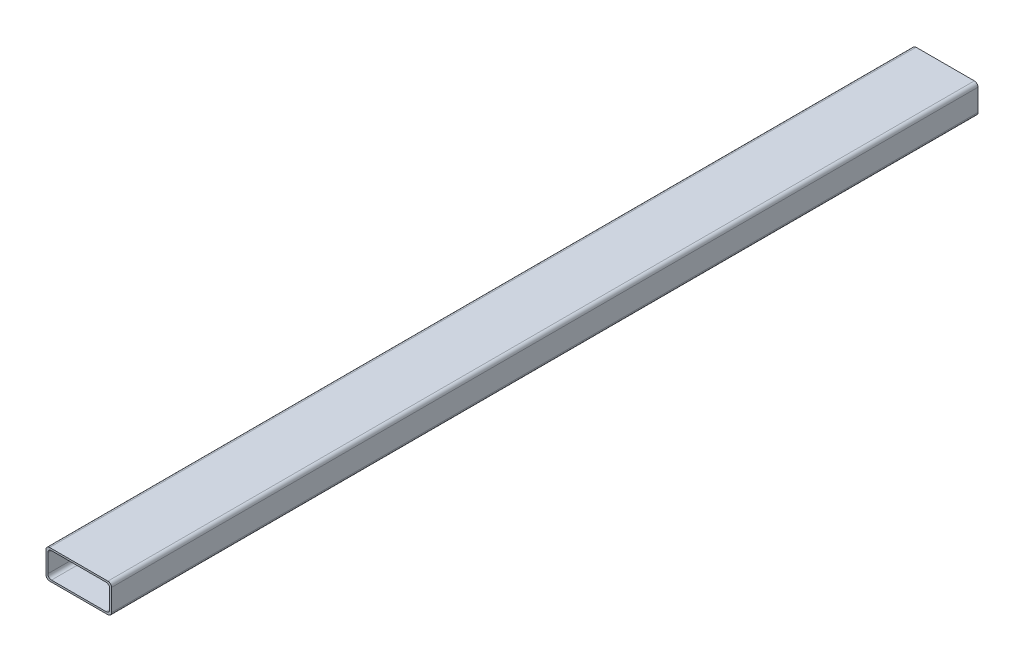
ISO-10303-21;
HEADER;
FILE_DESCRIPTION(('STEP AP214'),'2;1');
FILE_NAME('part.step','',(''),(''),'','','');
FILE_SCHEMA(('AUTOMOTIVE_DESIGN { 1 0 10303 214 1 1 1 1 }'));
ENDSEC;
DATA;
#1=APPLICATION_CONTEXT('core data for automotive mechanical design processes');
#2=APPLICATION_PROTOCOL_DEFINITION('international standard','automotive_design',2000,#1);
#3=PRODUCT_CONTEXT('',#1,'mechanical');
#4=PRODUCT('Part','Part','',(#3));
#5=PRODUCT_RELATED_PRODUCT_CATEGORY('part','',(#4));
#6=PRODUCT_DEFINITION_FORMATION('','',#4);
#7=PRODUCT_DEFINITION_CONTEXT('part definition',#1,'design');
#8=PRODUCT_DEFINITION('design','',#6,#7);
#9=PRODUCT_DEFINITION_SHAPE('','',#8);
#10=(LENGTH_UNIT() NAMED_UNIT(*) SI_UNIT(.MILLI.,.METRE.));
#11=(NAMED_UNIT(*) PLANE_ANGLE_UNIT() SI_UNIT($,.RADIAN.));
#12=(NAMED_UNIT(*) SI_UNIT($,.STERADIAN.) SOLID_ANGLE_UNIT());
#13=UNCERTAINTY_MEASURE_WITH_UNIT(LENGTH_MEASURE(1.E-05),#10,'distance_accuracy_value','');
#14=(GEOMETRIC_REPRESENTATION_CONTEXT(3) GLOBAL_UNCERTAINTY_ASSIGNED_CONTEXT((#13)) GLOBAL_UNIT_ASSIGNED_CONTEXT((#10,
#11,#12)) REPRESENTATION_CONTEXT('',''));
#15=CARTESIAN_POINT('',(0.,0.,0.));
#16=DIRECTION('',(0.,0.,1.));
#17=DIRECTION('',(1.,0.,0.));
#18=AXIS2_PLACEMENT_3D('',#15,#16,#17);
#19=CARTESIAN_POINT('',(0.,0.,1511.3));
#20=DIRECTION('',(0.,0.,-1.));
#21=DIRECTION('',(-1.,0.,0.));
#22=AXIS2_PLACEMENT_3D('',#19,#20,#21);
#23=PLANE('',#22);
#24=DIRECTION('',(0.,-1.,0.));
#25=VECTOR('',#24,1.);
#26=CARTESIAN_POINT('',(-57.15,-25.4,1511.3));
#27=LINE('',#26,#25);
#28=CARTESIAN_POINT('',(-57.15,19.05,1511.3));
#29=VERTEX_POINT('',#28);
#30=CARTESIAN_POINT('',(-57.15,-19.05,1511.3));
#31=VERTEX_POINT('',#30);
#32=EDGE_CURVE('E181',#29,#31,#27,.T.);
#33=ORIENTED_EDGE('',*,*,#32,.T.);
#34=CARTESIAN_POINT('',(-50.8,-19.05,1511.3));
#35=DIRECTION('',(0.,0.,-1.));
#36=DIRECTION('',(-1.,0.,0.));
#37=AXIS2_PLACEMENT_3D('',#34,#35,#36);
#38=CIRCLE('',#37,6.35);
#39=CARTESIAN_POINT('',(-50.8,-25.4,1511.3));
#40=VERTEX_POINT('',#39);
#41=EDGE_CURVE('E227',#31,#40,#38,.F.);
#42=ORIENTED_EDGE('',*,*,#41,.T.);
#43=DIRECTION('',(1.,0.,0.));
#44=VECTOR('',#43,1.);
#45=CARTESIAN_POINT('',(-57.15,-25.4,1511.3));
#46=LINE('',#45,#44);
#47=CARTESIAN_POINT('',(50.8,-25.4,1511.3));
#48=VERTEX_POINT('',#47);
#49=EDGE_CURVE('E176',#40,#48,#46,.T.);
#50=ORIENTED_EDGE('',*,*,#49,.T.);
#51=CARTESIAN_POINT('',(50.8,-19.05,1511.3));
#52=DIRECTION('',(0.,0.,-1.));
#53=DIRECTION('',(-1.,0.,0.));
#54=AXIS2_PLACEMENT_3D('',#51,#52,#53);
#55=CIRCLE('',#54,6.35);
#56=CARTESIAN_POINT('',(57.15,-19.05,1511.3));
#57=VERTEX_POINT('',#56);
#58=EDGE_CURVE('E225',#48,#57,#55,.F.);
#59=ORIENTED_EDGE('',*,*,#58,.T.);
#60=DIRECTION('',(0.,1.,0.));
#61=VECTOR('',#60,1.);
#62=CARTESIAN_POINT('',(57.15,-25.4,1511.3));
#63=LINE('',#62,#61);
#64=CARTESIAN_POINT('',(57.15,19.05,1511.3));
#65=VERTEX_POINT('',#64);
#66=EDGE_CURVE('E280',#57,#65,#63,.T.);
#67=ORIENTED_EDGE('',*,*,#66,.T.);
#68=CARTESIAN_POINT('',(50.8,19.05,1511.3));
#69=DIRECTION('',(0.,0.,-1.));
#70=DIRECTION('',(-1.,0.,0.));
#71=AXIS2_PLACEMENT_3D('',#68,#69,#70);
#72=CIRCLE('',#71,6.35);
#73=CARTESIAN_POINT('',(50.8,25.4,1511.3));
#74=VERTEX_POINT('',#73);
#75=EDGE_CURVE('E58',#65,#74,#72,.F.);
#76=ORIENTED_EDGE('',*,*,#75,.T.);
#77=DIRECTION('',(-1.,0.,0.));
#78=VECTOR('',#77,1.);
#79=CARTESIAN_POINT('',(-57.15,25.4,1511.3));
#80=LINE('',#79,#78);
#81=CARTESIAN_POINT('',(-50.8,25.4,1511.3));
#82=VERTEX_POINT('',#81);
#83=EDGE_CURVE('E282',#74,#82,#80,.T.);
#84=ORIENTED_EDGE('',*,*,#83,.T.);
#85=CARTESIAN_POINT('',(-50.8,19.05,1511.3));
#86=DIRECTION('',(0.,0.,-1.));
#87=DIRECTION('',(-1.,0.,0.));
#88=AXIS2_PLACEMENT_3D('',#85,#86,#87);
#89=CIRCLE('',#88,6.35);
#90=EDGE_CURVE('E223',#82,#29,#89,.F.);
#91=ORIENTED_EDGE('',*,*,#90,.T.);
#92=EDGE_LOOP('',(#33,#42,#50,#59,#67,#76,#84,#91));
#93=FACE_BOUND('',#92,.T.);
#94=DIRECTION('',(0.,1.,0.));
#95=VECTOR('',#94,1.);
#96=CARTESIAN_POINT('',(53.975,-22.225,1511.3));
#97=LINE('',#96,#95);
#98=CARTESIAN_POINT('',(53.975,-15.875,1511.3));
#99=VERTEX_POINT('',#98);
#100=CARTESIAN_POINT('',(53.975,15.875,1511.3));
#101=VERTEX_POINT('',#100);
#102=EDGE_CURVE('E269',#99,#101,#97,.T.);
#103=ORIENTED_EDGE('',*,*,#102,.F.);
#104=CARTESIAN_POINT('',(47.625,-15.875,1511.3));
#105=DIRECTION('',(0.,0.,-1.));
#106=DIRECTION('',(-1.,0.,0.));
#107=AXIS2_PLACEMENT_3D('',#104,#105,#106);
#108=CIRCLE('',#107,6.35);
#109=CARTESIAN_POINT('',(47.625,-22.225,1511.3));
#110=VERTEX_POINT('',#109);
#111=EDGE_CURVE('E161',#99,#110,#108,.T.);
#112=ORIENTED_EDGE('',*,*,#111,.T.);
#113=DIRECTION('',(1.,0.,0.));
#114=VECTOR('',#113,1.);
#115=CARTESIAN_POINT('',(-53.975,-22.225,1511.3));
#116=LINE('',#115,#114);
#117=CARTESIAN_POINT('',(-47.625,-22.225,1511.3));
#118=VERTEX_POINT('',#117);
#119=EDGE_CURVE('E271',#118,#110,#116,.T.);
#120=ORIENTED_EDGE('',*,*,#119,.F.);
#121=CARTESIAN_POINT('',(-47.625,-15.875,1511.3));
#122=DIRECTION('',(0.,0.,-1.));
#123=DIRECTION('',(-1.,0.,0.));
#124=AXIS2_PLACEMENT_3D('',#121,#122,#123);
#125=CIRCLE('',#124,6.35);
#126=CARTESIAN_POINT('',(-53.975,-15.875,1511.3));
#127=VERTEX_POINT('',#126);
#128=EDGE_CURVE('E244',#118,#127,#125,.T.);
#129=ORIENTED_EDGE('',*,*,#128,.T.);
#130=DIRECTION('',(0.,-1.,0.));
#131=VECTOR('',#130,1.);
#132=CARTESIAN_POINT('',(-53.975,-22.225,1511.3));
#133=LINE('',#132,#131);
#134=CARTESIAN_POINT('',(-53.975,15.875,1511.3));
#135=VERTEX_POINT('',#134);
#136=EDGE_CURVE('E265',#135,#127,#133,.T.);
#137=ORIENTED_EDGE('',*,*,#136,.F.);
#138=CARTESIAN_POINT('',(-47.625,15.875,1511.3));
#139=DIRECTION('',(0.,0.,-1.));
#140=DIRECTION('',(-1.,0.,0.));
#141=AXIS2_PLACEMENT_3D('',#138,#139,#140);
#142=CIRCLE('',#141,6.35);
#143=CARTESIAN_POINT('',(-47.625,22.225,1511.3));
#144=VERTEX_POINT('',#143);
#145=EDGE_CURVE('E11',#135,#144,#142,.T.);
#146=ORIENTED_EDGE('',*,*,#145,.T.);
#147=DIRECTION('',(-1.,0.,0.));
#148=VECTOR('',#147,1.);
#149=CARTESIAN_POINT('',(-53.975,22.225,1511.3));
#150=LINE('',#149,#148);
#151=CARTESIAN_POINT('',(47.625,22.225,1511.3));
#152=VERTEX_POINT('',#151);
#153=EDGE_CURVE('E263',#152,#144,#150,.T.);
#154=ORIENTED_EDGE('',*,*,#153,.F.);
#155=CARTESIAN_POINT('',(47.625,15.875,1511.3));
#156=DIRECTION('',(0.,0.,-1.));
#157=DIRECTION('',(-1.,0.,0.));
#158=AXIS2_PLACEMENT_3D('',#155,#156,#157);
#159=CIRCLE('',#158,6.35);
#160=EDGE_CURVE('E162',#152,#101,#159,.T.);
#161=ORIENTED_EDGE('',*,*,#160,.T.);
#162=EDGE_LOOP('',(#103,#112,#120,#129,#137,#146,#154,#161));
#163=FACE_BOUND('',#162,.T.);
#164=ADVANCED_FACE('F36',(#93,#163),#23,.F.);
#165=CARTESIAN_POINT('',(0.,0.,0.));
#166=DIRECTION('',(0.,0.,-1.));
#167=DIRECTION('',(-1.,0.,0.));
#168=AXIS2_PLACEMENT_3D('',#165,#166,#167);
#169=PLANE('',#168);
#170=DIRECTION('',(1.,0.,0.));
#171=VECTOR('',#170,1.);
#172=CARTESIAN_POINT('',(-57.15,-25.4,0.));
#173=LINE('',#172,#171);
#174=CARTESIAN_POINT('',(-50.8,-25.4,0.));
#175=VERTEX_POINT('',#174);
#176=CARTESIAN_POINT('',(50.8,-25.4,0.));
#177=VERTEX_POINT('',#176);
#178=EDGE_CURVE('E184',#175,#177,#173,.T.);
#179=ORIENTED_EDGE('',*,*,#178,.F.);
#180=CARTESIAN_POINT('',(-50.8,-19.05,0.));
#181=DIRECTION('',(0.,0.,-1.));
#182=DIRECTION('',(-1.,0.,0.));
#183=AXIS2_PLACEMENT_3D('',#180,#181,#182);
#184=CIRCLE('',#183,6.35);
#185=CARTESIAN_POINT('',(-57.15,-19.05,0.));
#186=VERTEX_POINT('',#185);
#187=EDGE_CURVE('E214',#175,#186,#184,.T.);
#188=ORIENTED_EDGE('',*,*,#187,.T.);
#189=DIRECTION('',(0.,-1.,0.));
#190=VECTOR('',#189,1.);
#191=CARTESIAN_POINT('',(-57.15,-25.4,0.));
#192=LINE('',#191,#190);
#193=CARTESIAN_POINT('',(-57.15,19.05,0.));
#194=VERTEX_POINT('',#193);
#195=EDGE_CURVE('E289',#194,#186,#192,.T.);
#196=ORIENTED_EDGE('',*,*,#195,.F.);
#197=CARTESIAN_POINT('',(-50.8,19.05,0.));
#198=DIRECTION('',(0.,0.,-1.));
#199=DIRECTION('',(-1.,0.,0.));
#200=AXIS2_PLACEMENT_3D('',#197,#198,#199);
#201=CIRCLE('',#200,6.35);
#202=CARTESIAN_POINT('',(-50.8,25.4,0.));
#203=VERTEX_POINT('',#202);
#204=EDGE_CURVE('E210',#194,#203,#201,.T.);
#205=ORIENTED_EDGE('',*,*,#204,.T.);
#206=DIRECTION('',(-1.,0.,0.));
#207=VECTOR('',#206,1.);
#208=CARTESIAN_POINT('',(-57.15,25.4,0.));
#209=LINE('',#208,#207);
#210=CARTESIAN_POINT('',(50.8,25.4,0.));
#211=VERTEX_POINT('',#210);
#212=EDGE_CURVE('E288',#211,#203,#209,.T.);
#213=ORIENTED_EDGE('',*,*,#212,.F.);
#214=CARTESIAN_POINT('',(50.8,19.05,0.));
#215=DIRECTION('',(0.,0.,-1.));
#216=DIRECTION('',(-1.,0.,0.));
#217=AXIS2_PLACEMENT_3D('',#214,#215,#216);
#218=CIRCLE('',#217,6.35);
#219=CARTESIAN_POINT('',(57.15,19.05,0.));
#220=VERTEX_POINT('',#219);
#221=EDGE_CURVE('E208',#211,#220,#218,.T.);
#222=ORIENTED_EDGE('',*,*,#221,.T.);
#223=DIRECTION('',(0.,1.,0.));
#224=VECTOR('',#223,1.);
#225=CARTESIAN_POINT('',(57.15,-25.4,0.));
#226=LINE('',#225,#224);
#227=CARTESIAN_POINT('',(57.15,-19.05,0.));
#228=VERTEX_POINT('',#227);
#229=EDGE_CURVE('E276',#228,#220,#226,.T.);
#230=ORIENTED_EDGE('',*,*,#229,.F.);
#231=CARTESIAN_POINT('',(50.8,-19.05,0.));
#232=DIRECTION('',(0.,0.,-1.));
#233=DIRECTION('',(-1.,0.,0.));
#234=AXIS2_PLACEMENT_3D('',#231,#232,#233);
#235=CIRCLE('',#234,6.35);
#236=EDGE_CURVE('E212',#228,#177,#235,.T.);
#237=ORIENTED_EDGE('',*,*,#236,.T.);
#238=EDGE_LOOP('',(#179,#188,#196,#205,#213,#222,#230,#237));
#239=FACE_BOUND('',#238,.T.);
#240=DIRECTION('',(0.,-1.,0.));
#241=VECTOR('',#240,1.);
#242=CARTESIAN_POINT('',(-53.975,-22.225,0.));
#243=LINE('',#242,#241);
#244=CARTESIAN_POINT('',(-53.975,15.875,0.));
#245=VERTEX_POINT('',#244);
#246=CARTESIAN_POINT('',(-53.975,-15.875,0.));
#247=VERTEX_POINT('',#246);
#248=EDGE_CURVE('E247',#245,#247,#243,.T.);
#249=ORIENTED_EDGE('',*,*,#248,.T.);
#250=CARTESIAN_POINT('',(-47.625,-15.875,0.));
#251=DIRECTION('',(0.,0.,-1.));
#252=DIRECTION('',(-1.,0.,0.));
#253=AXIS2_PLACEMENT_3D('',#250,#251,#252);
#254=CIRCLE('',#253,6.35);
#255=CARTESIAN_POINT('',(-47.625,-22.225,0.));
#256=VERTEX_POINT('',#255);
#257=EDGE_CURVE('E242',#247,#256,#254,.F.);
#258=ORIENTED_EDGE('',*,*,#257,.T.);
#259=DIRECTION('',(1.,0.,0.));
#260=VECTOR('',#259,1.);
#261=CARTESIAN_POINT('',(-53.975,-22.225,0.));
#262=LINE('',#261,#260);
#263=CARTESIAN_POINT('',(47.625,-22.225,0.));
#264=VERTEX_POINT('',#263);
#265=EDGE_CURVE('E156',#256,#264,#262,.T.);
#266=ORIENTED_EDGE('',*,*,#265,.T.);
#267=CARTESIAN_POINT('',(47.625,-15.875,0.));
#268=DIRECTION('',(0.,0.,-1.));
#269=DIRECTION('',(-1.,0.,0.));
#270=AXIS2_PLACEMENT_3D('',#267,#268,#269);
#271=CIRCLE('',#270,6.35);
#272=CARTESIAN_POINT('',(53.975,-15.875,0.));
#273=VERTEX_POINT('',#272);
#274=EDGE_CURVE('E150',#264,#273,#271,.F.);
#275=ORIENTED_EDGE('',*,*,#274,.T.);
#276=DIRECTION('',(0.,1.,0.));
#277=VECTOR('',#276,1.);
#278=CARTESIAN_POINT('',(53.975,-22.225,0.));
#279=LINE('',#278,#277);
#280=CARTESIAN_POINT('',(53.975,15.875,0.));
#281=VERTEX_POINT('',#280);
#282=EDGE_CURVE('E154',#273,#281,#279,.T.);
#283=ORIENTED_EDGE('',*,*,#282,.T.);
#284=CARTESIAN_POINT('',(47.625,15.875,0.));
#285=DIRECTION('',(0.,0.,-1.));
#286=DIRECTION('',(-1.,0.,0.));
#287=AXIS2_PLACEMENT_3D('',#284,#285,#286);
#288=CIRCLE('',#287,6.35);
#289=CARTESIAN_POINT('',(47.625,22.225,0.));
#290=VERTEX_POINT('',#289);
#291=EDGE_CURVE('E238',#281,#290,#288,.F.);
#292=ORIENTED_EDGE('',*,*,#291,.T.);
#293=DIRECTION('',(-1.,0.,0.));
#294=VECTOR('',#293,1.);
#295=CARTESIAN_POINT('',(-53.975,22.225,0.));
#296=LINE('',#295,#294);
#297=CARTESIAN_POINT('',(-47.625,22.225,0.));
#298=VERTEX_POINT('',#297);
#299=EDGE_CURVE('E172',#290,#298,#296,.T.);
#300=ORIENTED_EDGE('',*,*,#299,.T.);
#301=CARTESIAN_POINT('',(-47.625,15.875,0.));
#302=DIRECTION('',(0.,0.,-1.));
#303=DIRECTION('',(-1.,0.,0.));
#304=AXIS2_PLACEMENT_3D('',#301,#302,#303);
#305=CIRCLE('',#304,6.35);
#306=EDGE_CURVE('E44',#298,#245,#305,.F.);
#307=ORIENTED_EDGE('',*,*,#306,.T.);
#308=EDGE_LOOP('',(#249,#258,#266,#275,#283,#292,#300,#307));
#309=FACE_BOUND('',#308,.T.);
#310=ADVANCED_FACE('F153',(#239,#309),#169,.T.);
#311=CARTESIAN_POINT('',(57.15,-25.4,1511.3));
#312=DIRECTION('',(-1.,0.,0.));
#313=DIRECTION('',(0.,0.,1.));
#314=AXIS2_PLACEMENT_3D('',#311,#312,#313);
#315=PLANE('',#314);
#316=ORIENTED_EDGE('',*,*,#66,.F.);
#317=DIRECTION('',(0.,0.,-1.));
#318=VECTOR('',#317,1.);
#319=CARTESIAN_POINT('',(57.15,-19.05,1511.3));
#320=LINE('',#319,#318);
#321=EDGE_CURVE('E231',#57,#228,#320,.T.);
#322=ORIENTED_EDGE('',*,*,#321,.T.);
#323=ORIENTED_EDGE('',*,*,#229,.T.);
#324=DIRECTION('',(0.,0.,-1.));
#325=VECTOR('',#324,1.);
#326=CARTESIAN_POINT('',(57.15,19.05,1511.3));
#327=LINE('',#326,#325);
#328=EDGE_CURVE('E229',#220,#65,#327,.F.);
#329=ORIENTED_EDGE('',*,*,#328,.T.);
#330=EDGE_LOOP('',(#316,#322,#323,#329));
#331=FACE_BOUND('',#330,.T.);
#332=ADVANCED_FACE('F308',(#331),#315,.F.);
#333=CARTESIAN_POINT('',(-57.15,25.4,1511.3));
#334=DIRECTION('',(0.,-1.,0.));
#335=DIRECTION('',(0.,0.,-1.));
#336=AXIS2_PLACEMENT_3D('',#333,#334,#335);
#337=PLANE('',#336);
#338=ORIENTED_EDGE('',*,*,#212,.T.);
#339=DIRECTION('',(0.,0.,-1.));
#340=VECTOR('',#339,1.);
#341=CARTESIAN_POINT('',(-50.8,25.4,1511.3));
#342=LINE('',#341,#340);
#343=EDGE_CURVE('E51',#203,#82,#342,.F.);
#344=ORIENTED_EDGE('',*,*,#343,.T.);
#345=ORIENTED_EDGE('',*,*,#83,.F.);
#346=DIRECTION('',(0.,0.,-1.));
#347=VECTOR('',#346,1.);
#348=CARTESIAN_POINT('',(50.8,25.4,1511.3));
#349=LINE('',#348,#347);
#350=EDGE_CURVE('E234',#74,#211,#349,.T.);
#351=ORIENTED_EDGE('',*,*,#350,.T.);
#352=EDGE_LOOP('',(#338,#344,#345,#351));
#353=FACE_BOUND('',#352,.T.);
#354=ADVANCED_FACE('F314',(#353),#337,.F.);
#355=CARTESIAN_POINT('',(-57.15,-25.4,1511.3));
#356=DIRECTION('',(1.,0.,0.));
#357=DIRECTION('',(0.,0.,-1.));
#358=AXIS2_PLACEMENT_3D('',#355,#356,#357);
#359=PLANE('',#358);
#360=ORIENTED_EDGE('',*,*,#195,.T.);
#361=DIRECTION('',(0.,0.,-1.));
#362=VECTOR('',#361,1.);
#363=CARTESIAN_POINT('',(-57.15,-19.05,1511.3));
#364=LINE('',#363,#362);
#365=EDGE_CURVE('E219',#186,#31,#364,.F.);
#366=ORIENTED_EDGE('',*,*,#365,.T.);
#367=ORIENTED_EDGE('',*,*,#32,.F.);
#368=DIRECTION('',(0.,0.,-1.));
#369=VECTOR('',#368,1.);
#370=CARTESIAN_POINT('',(-57.15,19.05,1511.3));
#371=LINE('',#370,#369);
#372=EDGE_CURVE('E216',#29,#194,#371,.T.);
#373=ORIENTED_EDGE('',*,*,#372,.T.);
#374=EDGE_LOOP('',(#360,#366,#367,#373));
#375=FACE_BOUND('',#374,.T.);
#376=ADVANCED_FACE('F320',(#375),#359,.F.);
#377=CARTESIAN_POINT('',(-57.15,-25.4,1511.3));
#378=DIRECTION('',(0.,1.,0.));
#379=DIRECTION('',(0.,0.,1.));
#380=AXIS2_PLACEMENT_3D('',#377,#378,#379);
#381=PLANE('',#380);
#382=ORIENTED_EDGE('',*,*,#49,.F.);
#383=DIRECTION('',(0.,0.,-1.));
#384=VECTOR('',#383,1.);
#385=CARTESIAN_POINT('',(-50.8,-25.4,1511.3));
#386=LINE('',#385,#384);
#387=EDGE_CURVE('E204',#40,#175,#386,.T.);
#388=ORIENTED_EDGE('',*,*,#387,.T.);
#389=ORIENTED_EDGE('',*,*,#178,.T.);
#390=DIRECTION('',(0.,0.,-1.));
#391=VECTOR('',#390,1.);
#392=CARTESIAN_POINT('',(50.8,-25.4,1511.3));
#393=LINE('',#392,#391);
#394=EDGE_CURVE('E202',#177,#48,#393,.F.);
#395=ORIENTED_EDGE('',*,*,#394,.T.);
#396=EDGE_LOOP('',(#382,#388,#389,#395));
#397=FACE_BOUND('',#396,.T.);
#398=ADVANCED_FACE('F299',(#397),#381,.F.);
#399=CARTESIAN_POINT('',(53.975,-22.225,1511.3));
#400=DIRECTION('',(-1.,0.,0.));
#401=DIRECTION('',(0.,-1.,0.));
#402=AXIS2_PLACEMENT_3D('',#399,#400,#401);
#403=PLANE('',#402);
#404=ORIENTED_EDGE('',*,*,#102,.T.);
#405=DIRECTION('',(0.,0.,-1.));
#406=VECTOR('',#405,1.);
#407=CARTESIAN_POINT('',(53.975,15.875,0.));
#408=LINE('',#407,#406);
#409=EDGE_CURVE('E171',#101,#281,#408,.T.);
#410=ORIENTED_EDGE('',*,*,#409,.T.);
#411=ORIENTED_EDGE('',*,*,#282,.F.);
#412=DIRECTION('',(0.,0.,-1.));
#413=VECTOR('',#412,1.);
#414=CARTESIAN_POINT('',(53.975,-15.875,1511.3));
#415=LINE('',#414,#413);
#416=EDGE_CURVE('E168',#273,#99,#415,.F.);
#417=ORIENTED_EDGE('',*,*,#416,.T.);
#418=EDGE_LOOP('',(#404,#410,#411,#417));
#419=FACE_BOUND('',#418,.T.);
#420=ADVANCED_FACE('F167',(#419),#403,.T.);
#421=CARTESIAN_POINT('',(-53.975,22.225,1511.3));
#422=DIRECTION('',(0.,-1.,0.));
#423=DIRECTION('',(0.,0.,-1.));
#424=AXIS2_PLACEMENT_3D('',#421,#422,#423);
#425=PLANE('',#424);
#426=ORIENTED_EDGE('',*,*,#299,.F.);
#427=DIRECTION('',(0.,0.,-1.));
#428=VECTOR('',#427,1.);
#429=CARTESIAN_POINT('',(47.625,22.225,1511.3));
#430=LINE('',#429,#428);
#431=EDGE_CURVE('E189',#290,#152,#430,.F.);
#432=ORIENTED_EDGE('',*,*,#431,.T.);
#433=ORIENTED_EDGE('',*,*,#153,.T.);
#434=DIRECTION('',(0.,0.,-1.));
#435=VECTOR('',#434,1.);
#436=CARTESIAN_POINT('',(-47.625,22.225,0.));
#437=LINE('',#436,#435);
#438=EDGE_CURVE('E178',#144,#298,#437,.T.);
#439=ORIENTED_EDGE('',*,*,#438,.T.);
#440=EDGE_LOOP('',(#426,#432,#433,#439));
#441=FACE_BOUND('',#440,.T.);
#442=ADVANCED_FACE('F267',(#441),#425,.T.);
#443=CARTESIAN_POINT('',(-53.975,-22.225,1511.3));
#444=DIRECTION('',(1.,0.,0.));
#445=DIRECTION('',(0.,1.,0.));
#446=AXIS2_PLACEMENT_3D('',#443,#444,#445);
#447=PLANE('',#446);
#448=ORIENTED_EDGE('',*,*,#136,.T.);
#449=DIRECTION('',(0.,0.,-1.));
#450=VECTOR('',#449,1.);
#451=CARTESIAN_POINT('',(-53.975,-15.875,0.));
#452=LINE('',#451,#450);
#453=EDGE_CURVE('E198',#127,#247,#452,.T.);
#454=ORIENTED_EDGE('',*,*,#453,.T.);
#455=ORIENTED_EDGE('',*,*,#248,.F.);
#456=DIRECTION('',(0.,0.,-1.));
#457=VECTOR('',#456,1.);
#458=CARTESIAN_POINT('',(-53.975,15.875,1511.3));
#459=LINE('',#458,#457);
#460=EDGE_CURVE('E196',#245,#135,#459,.F.);
#461=ORIENTED_EDGE('',*,*,#460,.T.);
#462=EDGE_LOOP('',(#448,#454,#455,#461));
#463=FACE_BOUND('',#462,.T.);
#464=ADVANCED_FACE('F254',(#463),#447,.T.);
#465=CARTESIAN_POINT('',(-53.975,-22.225,1511.3));
#466=DIRECTION('',(0.,1.,0.));
#467=DIRECTION('',(0.,0.,1.));
#468=AXIS2_PLACEMENT_3D('',#465,#466,#467);
#469=PLANE('',#468);
#470=ORIENTED_EDGE('',*,*,#119,.T.);
#471=DIRECTION('',(0.,0.,-1.));
#472=VECTOR('',#471,1.);
#473=CARTESIAN_POINT('',(47.625,-22.225,0.));
#474=LINE('',#473,#472);
#475=EDGE_CURVE('E194',#110,#264,#474,.T.);
#476=ORIENTED_EDGE('',*,*,#475,.T.);
#477=ORIENTED_EDGE('',*,*,#265,.F.);
#478=DIRECTION('',(0.,0.,-1.));
#479=VECTOR('',#478,1.);
#480=CARTESIAN_POINT('',(-47.625,-22.225,1511.3));
#481=LINE('',#480,#479);
#482=EDGE_CURVE('E191',#256,#118,#481,.F.);
#483=ORIENTED_EDGE('',*,*,#482,.T.);
#484=EDGE_LOOP('',(#470,#476,#477,#483));
#485=FACE_BOUND('',#484,.T.);
#486=ADVANCED_FACE('F353',(#485),#469,.T.);
#487=CARTESIAN_POINT('',(47.625,15.875,1511.3));
#488=DIRECTION('',(0.,0.,1.));
#489=DIRECTION('',(1.,0.,0.));
#490=AXIS2_PLACEMENT_3D('',#487,#488,#489);
#491=CYLINDRICAL_SURFACE('',#490,6.35);
#492=ORIENTED_EDGE('',*,*,#160,.F.);
#493=ORIENTED_EDGE('',*,*,#431,.F.);
#494=ORIENTED_EDGE('',*,*,#291,.F.);
#495=ORIENTED_EDGE('',*,*,#409,.F.);
#496=EDGE_LOOP('',(#492,#493,#494,#495));
#497=FACE_BOUND('',#496,.T.);
#498=ADVANCED_FACE('F350',(#497),#491,.F.);
#499=CARTESIAN_POINT('',(47.625,-15.875,1511.3));
#500=DIRECTION('',(0.,0.,1.));
#501=DIRECTION('',(1.,0.,0.));
#502=AXIS2_PLACEMENT_3D('',#499,#500,#501);
#503=CYLINDRICAL_SURFACE('',#502,6.35);
#504=ORIENTED_EDGE('',*,*,#111,.F.);
#505=ORIENTED_EDGE('',*,*,#416,.F.);
#506=ORIENTED_EDGE('',*,*,#274,.F.);
#507=ORIENTED_EDGE('',*,*,#475,.F.);
#508=EDGE_LOOP('',(#504,#505,#506,#507));
#509=FACE_BOUND('',#508,.T.);
#510=ADVANCED_FACE('F175',(#509),#503,.F.);
#511=CARTESIAN_POINT('',(-47.625,-15.875,1511.3));
#512=DIRECTION('',(0.,0.,1.));
#513=DIRECTION('',(1.,0.,0.));
#514=AXIS2_PLACEMENT_3D('',#511,#512,#513);
#515=CYLINDRICAL_SURFACE('',#514,6.35);
#516=ORIENTED_EDGE('',*,*,#128,.F.);
#517=ORIENTED_EDGE('',*,*,#482,.F.);
#518=ORIENTED_EDGE('',*,*,#257,.F.);
#519=ORIENTED_EDGE('',*,*,#453,.F.);
#520=EDGE_LOOP('',(#516,#517,#518,#519));
#521=FACE_BOUND('',#520,.T.);
#522=ADVANCED_FACE('F331',(#521),#515,.F.);
#523=CARTESIAN_POINT('',(-47.625,15.875,1511.3));
#524=DIRECTION('',(0.,0.,1.));
#525=DIRECTION('',(1.,0.,0.));
#526=AXIS2_PLACEMENT_3D('',#523,#524,#525);
#527=CYLINDRICAL_SURFACE('',#526,6.35);
#528=ORIENTED_EDGE('',*,*,#145,.F.);
#529=ORIENTED_EDGE('',*,*,#460,.F.);
#530=ORIENTED_EDGE('',*,*,#306,.F.);
#531=ORIENTED_EDGE('',*,*,#438,.F.);
#532=EDGE_LOOP('',(#528,#529,#530,#531));
#533=FACE_BOUND('',#532,.T.);
#534=ADVANCED_FACE('F259',(#533),#527,.F.);
#535=CARTESIAN_POINT('',(-50.8,-19.05,1511.3));
#536=DIRECTION('',(0.,0.,-1.));
#537=DIRECTION('',(-1.,0.,0.));
#538=AXIS2_PLACEMENT_3D('',#535,#536,#537);
#539=CYLINDRICAL_SURFACE('',#538,6.35);
#540=ORIENTED_EDGE('',*,*,#41,.F.);
#541=ORIENTED_EDGE('',*,*,#365,.F.);
#542=ORIENTED_EDGE('',*,*,#187,.F.);
#543=ORIENTED_EDGE('',*,*,#387,.F.);
#544=EDGE_LOOP('',(#540,#541,#542,#543));
#545=FACE_BOUND('',#544,.T.);
#546=ADVANCED_FACE('F323',(#545),#539,.T.);
#547=CARTESIAN_POINT('',(50.8,-19.05,1511.3));
#548=DIRECTION('',(0.,0.,-1.));
#549=DIRECTION('',(-1.,0.,0.));
#550=AXIS2_PLACEMENT_3D('',#547,#548,#549);
#551=CYLINDRICAL_SURFACE('',#550,6.35);
#552=ORIENTED_EDGE('',*,*,#58,.F.);
#553=ORIENTED_EDGE('',*,*,#394,.F.);
#554=ORIENTED_EDGE('',*,*,#236,.F.);
#555=ORIENTED_EDGE('',*,*,#321,.F.);
#556=EDGE_LOOP('',(#552,#553,#554,#555));
#557=FACE_BOUND('',#556,.T.);
#558=ADVANCED_FACE('F304',(#557),#551,.T.);
#559=CARTESIAN_POINT('',(-50.8,19.05,1511.3));
#560=DIRECTION('',(0.,0.,-1.));
#561=DIRECTION('',(-1.,0.,0.));
#562=AXIS2_PLACEMENT_3D('',#559,#560,#561);
#563=CYLINDRICAL_SURFACE('',#562,6.35);
#564=ORIENTED_EDGE('',*,*,#90,.F.);
#565=ORIENTED_EDGE('',*,*,#343,.F.);
#566=ORIENTED_EDGE('',*,*,#204,.F.);
#567=ORIENTED_EDGE('',*,*,#372,.F.);
#568=EDGE_LOOP('',(#564,#565,#566,#567));
#569=FACE_BOUND('',#568,.T.);
#570=ADVANCED_FACE('F318',(#569),#563,.T.);
#571=CARTESIAN_POINT('',(50.8,19.05,1511.3));
#572=DIRECTION('',(0.,0.,-1.));
#573=DIRECTION('',(-1.,0.,0.));
#574=AXIS2_PLACEMENT_3D('',#571,#572,#573);
#575=CYLINDRICAL_SURFACE('',#574,6.35);
#576=ORIENTED_EDGE('',*,*,#75,.F.);
#577=ORIENTED_EDGE('',*,*,#328,.F.);
#578=ORIENTED_EDGE('',*,*,#221,.F.);
#579=ORIENTED_EDGE('',*,*,#350,.F.);
#580=EDGE_LOOP('',(#576,#577,#578,#579));
#581=FACE_BOUND('',#580,.T.);
#582=ADVANCED_FACE('F38',(#581),#575,.T.);
#583=CLOSED_SHELL('',(#164,#310,#332,#354,#376,#398,#420,#442,#464,#486,#498,#510,#522,#534,
#546,#558,#570,#582));
#584=MANIFOLD_SOLID_BREP('B2',#583);
#585=ADVANCED_BREP_SHAPE_REPRESENTATION('',(#18,#584),#14);
#586=SHAPE_DEFINITION_REPRESENTATION(#9,#585);
ENDSEC;
END-ISO-10303-21;
